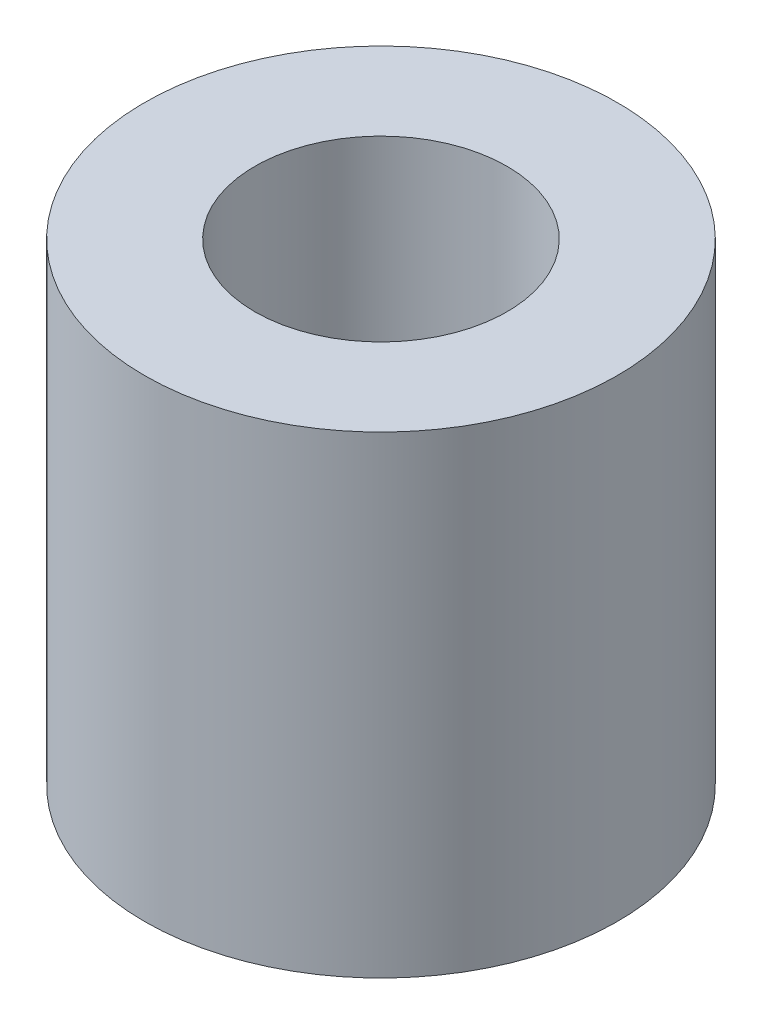
ISO-10303-21;
HEADER;
FILE_DESCRIPTION(('STEP AP214'),'2;1');
FILE_NAME('part.step','',(''),(''),'','','');
FILE_SCHEMA(('AUTOMOTIVE_DESIGN { 1 0 10303 214 1 1 1 1 }'));
ENDSEC;
DATA;
#1=APPLICATION_CONTEXT('core data for automotive mechanical design processes');
#2=APPLICATION_PROTOCOL_DEFINITION('international standard','automotive_design',2000,#1);
#3=PRODUCT_CONTEXT('',#1,'mechanical');
#4=PRODUCT('Part','Part','',(#3));
#5=PRODUCT_RELATED_PRODUCT_CATEGORY('part','',(#4));
#6=PRODUCT_DEFINITION_FORMATION('','',#4);
#7=PRODUCT_DEFINITION_CONTEXT('part definition',#1,'design');
#8=PRODUCT_DEFINITION('design','',#6,#7);
#9=PRODUCT_DEFINITION_SHAPE('','',#8);
#10=(LENGTH_UNIT() NAMED_UNIT(*) SI_UNIT(.MILLI.,.METRE.));
#11=(NAMED_UNIT(*) PLANE_ANGLE_UNIT() SI_UNIT($,.RADIAN.));
#12=(NAMED_UNIT(*) SI_UNIT($,.STERADIAN.) SOLID_ANGLE_UNIT());
#13=UNCERTAINTY_MEASURE_WITH_UNIT(LENGTH_MEASURE(1.E-05),#10,'distance_accuracy_value','');
#14=(GEOMETRIC_REPRESENTATION_CONTEXT(3) GLOBAL_UNCERTAINTY_ASSIGNED_CONTEXT((#13)) GLOBAL_UNIT_ASSIGNED_CONTEXT((#10,
#11,#12)) REPRESENTATION_CONTEXT('',''));
#15=CARTESIAN_POINT('',(0.,0.,0.));
#16=DIRECTION('',(0.,0.,1.));
#17=DIRECTION('',(1.,0.,0.));
#18=AXIS2_PLACEMENT_3D('',#15,#16,#17);
#19=CARTESIAN_POINT('',(0.,9.525,0.));
#20=DIRECTION('',(0.,1.,0.));
#21=DIRECTION('',(0.,0.,-1.));
#22=AXIS2_PLACEMENT_3D('',#19,#20,#21);
#23=PLANE('',#22);
#24=CARTESIAN_POINT('',(0.,9.525,0.));
#25=DIRECTION('',(0.,-1.,0.));
#26=DIRECTION('',(0.,0.,-1.));
#27=AXIS2_PLACEMENT_3D('',#24,#25,#26);
#28=CIRCLE('',#27,4.7625);
#29=CARTESIAN_POINT('',(0.,9.525,4.7625));
#30=VERTEX_POINT('',#29);
#31=EDGE_CURVE('E10',#30,#30,#28,.T.);
#32=ORIENTED_EDGE('',*,*,#31,.F.);
#33=EDGE_LOOP('',(#32));
#34=FACE_BOUND('',#33,.T.);
#35=CARTESIAN_POINT('',(0.,9.525,0.));
#36=DIRECTION('',(0.,-1.,0.));
#37=DIRECTION('',(0.,0.,-1.));
#38=AXIS2_PLACEMENT_3D('',#35,#36,#37);
#39=CIRCLE('',#38,2.54);
#40=CARTESIAN_POINT('',(0.,9.525,2.54));
#41=VERTEX_POINT('',#40);
#42=EDGE_CURVE('E58',#41,#41,#39,.T.);
#43=ORIENTED_EDGE('',*,*,#42,.T.);
#44=EDGE_LOOP('',(#43));
#45=FACE_BOUND('',#44,.T.);
#46=ADVANCED_FACE('F45',(#34,#45),#23,.T.);
#47=CARTESIAN_POINT('',(0.,0.,0.));
#48=DIRECTION('',(0.,1.,0.));
#49=DIRECTION('',(0.,0.,-1.));
#50=AXIS2_PLACEMENT_3D('',#47,#48,#49);
#51=PLANE('',#50);
#52=CARTESIAN_POINT('',(0.,0.,0.));
#53=DIRECTION('',(0.,-1.,0.));
#54=DIRECTION('',(0.,0.,-1.));
#55=AXIS2_PLACEMENT_3D('',#52,#53,#54);
#56=CIRCLE('',#55,4.7625);
#57=CARTESIAN_POINT('',(0.,0.,4.7625));
#58=VERTEX_POINT('',#57);
#59=EDGE_CURVE('E49',#58,#58,#56,.T.);
#60=ORIENTED_EDGE('',*,*,#59,.T.);
#61=EDGE_LOOP('',(#60));
#62=FACE_BOUND('',#61,.T.);
#63=CARTESIAN_POINT('',(0.,0.,0.));
#64=DIRECTION('',(0.,-1.,0.));
#65=DIRECTION('',(0.,0.,-1.));
#66=AXIS2_PLACEMENT_3D('',#63,#64,#65);
#67=CIRCLE('',#66,2.54);
#68=CARTESIAN_POINT('',(0.,0.,2.54));
#69=VERTEX_POINT('',#68);
#70=EDGE_CURVE('E60',#69,#69,#67,.T.);
#71=ORIENTED_EDGE('',*,*,#70,.F.);
#72=EDGE_LOOP('',(#71));
#73=FACE_BOUND('',#72,.T.);
#74=ADVANCED_FACE('F74',(#62,#73),#51,.F.);
#75=CARTESIAN_POINT('',(0.,9.525,0.));
#76=DIRECTION('',(0.,-1.,0.));
#77=DIRECTION('',(0.,0.,1.));
#78=AXIS2_PLACEMENT_3D('',#75,#76,#77);
#79=CYLINDRICAL_SURFACE('',#78,4.7625);
#80=CARTESIAN_POINT('',(0.,9.525,4.7625));
#81=CARTESIAN_POINT('',(0.,9.42578125,4.7625));
#82=CARTESIAN_POINT('',(0.,9.3265625,4.7625));
#83=CARTESIAN_POINT('',(0.,9.128125,4.7625));
#84=CARTESIAN_POINT('',(0.,9.02890625,4.7625));
#85=CARTESIAN_POINT('',(0.,8.83046875,4.7625));
#86=CARTESIAN_POINT('',(0.,8.73125,4.7625));
#87=CARTESIAN_POINT('',(0.,8.5328125,4.7625));
#88=CARTESIAN_POINT('',(0.,8.43359375,4.7625));
#89=CARTESIAN_POINT('',(0.,8.23515625,4.7625));
#90=CARTESIAN_POINT('',(0.,8.1359375,4.7625));
#91=CARTESIAN_POINT('',(0.,7.9375,4.7625));
#92=CARTESIAN_POINT('',(0.,7.83828125,4.7625));
#93=CARTESIAN_POINT('',(0.,7.63984375,4.7625));
#94=CARTESIAN_POINT('',(0.,7.540625,4.7625));
#95=CARTESIAN_POINT('',(0.,7.3421875,4.7625));
#96=CARTESIAN_POINT('',(0.,7.24296875,4.7625));
#97=CARTESIAN_POINT('',(0.,7.04453125,4.7625));
#98=CARTESIAN_POINT('',(0.,6.9453125,4.7625));
#99=CARTESIAN_POINT('',(0.,6.746875,4.7625));
#100=CARTESIAN_POINT('',(0.,6.64765625,4.7625));
#101=CARTESIAN_POINT('',(0.,6.44921875,4.7625));
#102=CARTESIAN_POINT('',(0.,6.35,4.7625));
#103=CARTESIAN_POINT('',(0.,6.1515625,4.7625));
#104=CARTESIAN_POINT('',(0.,6.05234375,4.7625));
#105=CARTESIAN_POINT('',(0.,5.85390625,4.7625));
#106=CARTESIAN_POINT('',(0.,5.7546875,4.7625));
#107=CARTESIAN_POINT('',(0.,5.55625,4.7625));
#108=CARTESIAN_POINT('',(0.,5.45703125,4.7625));
#109=CARTESIAN_POINT('',(0.,5.25859375,4.7625));
#110=CARTESIAN_POINT('',(0.,5.159375,4.7625));
#111=CARTESIAN_POINT('',(0.,4.9609375,4.7625));
#112=CARTESIAN_POINT('',(0.,4.86171875,4.7625));
#113=CARTESIAN_POINT('',(0.,4.66328125,4.7625));
#114=CARTESIAN_POINT('',(0.,4.5640625,4.7625));
#115=CARTESIAN_POINT('',(0.,4.365625,4.7625));
#116=CARTESIAN_POINT('',(0.,4.26640625,4.7625));
#117=CARTESIAN_POINT('',(0.,4.06796875,4.7625));
#118=CARTESIAN_POINT('',(0.,3.96875,4.7625));
#119=CARTESIAN_POINT('',(0.,3.7703125,4.7625));
#120=CARTESIAN_POINT('',(0.,3.67109375,4.7625));
#121=CARTESIAN_POINT('',(0.,3.47265625,4.7625));
#122=CARTESIAN_POINT('',(0.,3.3734375,4.7625));
#123=CARTESIAN_POINT('',(0.,3.175,4.7625));
#124=CARTESIAN_POINT('',(0.,3.07578125,4.7625));
#125=CARTESIAN_POINT('',(0.,2.87734375,4.7625));
#126=CARTESIAN_POINT('',(0.,2.778125,4.7625));
#127=CARTESIAN_POINT('',(0.,2.5796875,4.7625));
#128=CARTESIAN_POINT('',(0.,2.48046875,4.7625));
#129=CARTESIAN_POINT('',(0.,2.28203125,4.7625));
#130=CARTESIAN_POINT('',(0.,2.1828125,4.7625));
#131=CARTESIAN_POINT('',(0.,1.984375,4.7625));
#132=CARTESIAN_POINT('',(0.,1.88515625,4.7625));
#133=CARTESIAN_POINT('',(0.,1.68671875,4.7625));
#134=CARTESIAN_POINT('',(0.,1.5875,4.7625));
#135=CARTESIAN_POINT('',(0.,1.3890625,4.7625));
#136=CARTESIAN_POINT('',(0.,1.28984375,4.7625));
#137=CARTESIAN_POINT('',(0.,1.09140625,4.7625));
#138=CARTESIAN_POINT('',(0.,0.992187500000001,4.7625));
#139=CARTESIAN_POINT('',(0.,0.793750000000001,4.7625));
#140=CARTESIAN_POINT('',(0.,0.69453125,4.7625));
#141=CARTESIAN_POINT('',(0.,0.49609375,4.7625));
#142=CARTESIAN_POINT('',(0.,0.396875,4.7625));
#143=CARTESIAN_POINT('',(0.,0.1984375,4.7625));
#144=CARTESIAN_POINT('',(0.,0.0992187500000001,4.7625));
#145=CARTESIAN_POINT('',(0.,0.,4.7625));
#146=B_SPLINE_CURVE_WITH_KNOTS('',3,(#80,#81,#82,#83,#84,#85,#86,#87,#88,#89,#90,#91,#92,#93,
#94,#95,#96,#97,#98,#99,#100,#101,#102,#103,#104,#105,#106,#107,#108,#109,#110,#111,#112,#113,
#114,#115,#116,#117,#118,#119,#120,#121,#122,#123,#124,#125,#126,#127,#128,#129,#130,#131,#132,
#133,#134,#135,#136,#137,#138,#139,#140,#141,#142,#143,#144,#145),.UNSPECIFIED.,.F.,.F.,(4,2,2,
2,2,2,2,2,2,2,2,2,2,2,2,2,2,2,2,2,2,2,2,2,2,2,2,2,2,2,2,2,4),(0.,0.297656249999998,
0.595312499999999,0.892968749999999,1.190625,1.48828125,1.7859375,2.08359375,2.38125,2.67890625,
2.9765625,3.27421875,3.571875,3.86953125,4.1671875,4.46484375,4.7625,5.06015625,5.3578125,
5.65546875,5.953125,6.25078125,6.5484375,6.84609375,7.14375,7.44140625,7.7390625,8.03671875,
8.334375,8.63203125,8.9296875,9.22734375,9.525),.UNSPECIFIED.);
#147=EDGE_CURVE('BSEAM47',#30,#58,#146,.T.);
#148=ORIENTED_EDGE('',*,*,#31,.T.);
#149=ORIENTED_EDGE('',*,*,#59,.F.);
#150=ORIENTED_EDGE('',*,*,#147,.T.);
#151=ORIENTED_EDGE('',*,*,#147,.F.);
#152=EDGE_LOOP('',(#148,#150,#149,#151));
#153=FACE_BOUND('',#152,.T.);
#154=ADVANCED_FACE('F47',(#153),#79,.T.);
#155=CARTESIAN_POINT('',(0.,9.525,0.));
#156=DIRECTION('',(0.,-1.,0.));
#157=DIRECTION('',(0.,0.,1.));
#158=AXIS2_PLACEMENT_3D('',#155,#156,#157);
#159=CYLINDRICAL_SURFACE('',#158,2.54);
#160=CARTESIAN_POINT('',(0.,9.525,2.54));
#161=CARTESIAN_POINT('',(0.,9.42578125,2.54));
#162=CARTESIAN_POINT('',(0.,9.3265625,2.54));
#163=CARTESIAN_POINT('',(0.,9.128125,2.54));
#164=CARTESIAN_POINT('',(0.,9.02890625,2.54));
#165=CARTESIAN_POINT('',(0.,8.83046875,2.54));
#166=CARTESIAN_POINT('',(0.,8.73125,2.54));
#167=CARTESIAN_POINT('',(0.,8.5328125,2.54));
#168=CARTESIAN_POINT('',(0.,8.43359375,2.54));
#169=CARTESIAN_POINT('',(0.,8.23515625,2.54));
#170=CARTESIAN_POINT('',(0.,8.1359375,2.54));
#171=CARTESIAN_POINT('',(0.,7.9375,2.54));
#172=CARTESIAN_POINT('',(0.,7.83828125,2.54));
#173=CARTESIAN_POINT('',(0.,7.63984375,2.54));
#174=CARTESIAN_POINT('',(0.,7.540625,2.54));
#175=CARTESIAN_POINT('',(0.,7.3421875,2.54));
#176=CARTESIAN_POINT('',(0.,7.24296875,2.54));
#177=CARTESIAN_POINT('',(0.,7.04453125,2.54));
#178=CARTESIAN_POINT('',(0.,6.9453125,2.54));
#179=CARTESIAN_POINT('',(0.,6.746875,2.54));
#180=CARTESIAN_POINT('',(0.,6.64765625,2.54));
#181=CARTESIAN_POINT('',(0.,6.44921875,2.54));
#182=CARTESIAN_POINT('',(0.,6.35,2.54));
#183=CARTESIAN_POINT('',(0.,6.1515625,2.54));
#184=CARTESIAN_POINT('',(0.,6.05234375,2.54));
#185=CARTESIAN_POINT('',(0.,5.85390625,2.54));
#186=CARTESIAN_POINT('',(0.,5.7546875,2.54));
#187=CARTESIAN_POINT('',(0.,5.55625,2.54));
#188=CARTESIAN_POINT('',(0.,5.45703125,2.54));
#189=CARTESIAN_POINT('',(0.,5.25859375,2.54));
#190=CARTESIAN_POINT('',(0.,5.159375,2.54));
#191=CARTESIAN_POINT('',(0.,4.9609375,2.54));
#192=CARTESIAN_POINT('',(0.,4.86171875,2.54));
#193=CARTESIAN_POINT('',(0.,4.66328125,2.54));
#194=CARTESIAN_POINT('',(0.,4.5640625,2.54));
#195=CARTESIAN_POINT('',(0.,4.365625,2.54));
#196=CARTESIAN_POINT('',(0.,4.26640625,2.54));
#197=CARTESIAN_POINT('',(0.,4.06796875,2.54));
#198=CARTESIAN_POINT('',(0.,3.96875,2.54));
#199=CARTESIAN_POINT('',(0.,3.7703125,2.54));
#200=CARTESIAN_POINT('',(0.,3.67109375,2.54));
#201=CARTESIAN_POINT('',(0.,3.47265625,2.54));
#202=CARTESIAN_POINT('',(0.,3.3734375,2.54));
#203=CARTESIAN_POINT('',(0.,3.175,2.54));
#204=CARTESIAN_POINT('',(0.,3.07578125,2.54));
#205=CARTESIAN_POINT('',(0.,2.87734375,2.54));
#206=CARTESIAN_POINT('',(0.,2.778125,2.54));
#207=CARTESIAN_POINT('',(0.,2.5796875,2.54));
#208=CARTESIAN_POINT('',(0.,2.48046875,2.54));
#209=CARTESIAN_POINT('',(0.,2.28203125,2.54));
#210=CARTESIAN_POINT('',(0.,2.1828125,2.54));
#211=CARTESIAN_POINT('',(0.,1.984375,2.54));
#212=CARTESIAN_POINT('',(0.,1.88515625,2.54));
#213=CARTESIAN_POINT('',(0.,1.68671875,2.54));
#214=CARTESIAN_POINT('',(0.,1.5875,2.54));
#215=CARTESIAN_POINT('',(0.,1.3890625,2.54));
#216=CARTESIAN_POINT('',(0.,1.28984375,2.54));
#217=CARTESIAN_POINT('',(0.,1.09140625,2.54));
#218=CARTESIAN_POINT('',(0.,0.992187500000001,2.54));
#219=CARTESIAN_POINT('',(0.,0.793750000000001,2.54));
#220=CARTESIAN_POINT('',(0.,0.69453125,2.54));
#221=CARTESIAN_POINT('',(0.,0.49609375,2.54));
#222=CARTESIAN_POINT('',(0.,0.396875,2.54));
#223=CARTESIAN_POINT('',(0.,0.1984375,2.54));
#224=CARTESIAN_POINT('',(0.,0.0992187500000001,2.54));
#225=CARTESIAN_POINT('',(0.,0.,2.54));
#226=B_SPLINE_CURVE_WITH_KNOTS('',3,(#160,#161,#162,#163,#164,#165,#166,#167,#168,#169,#170,
#171,#172,#173,#174,#175,#176,#177,#178,#179,#180,#181,#182,#183,#184,#185,#186,#187,#188,#189,
#190,#191,#192,#193,#194,#195,#196,#197,#198,#199,#200,#201,#202,#203,#204,#205,#206,#207,#208,
#209,#210,#211,#212,#213,#214,#215,#216,#217,#218,#219,#220,#221,#222,#223,#224,#225),
.UNSPECIFIED.,.F.,.F.,(4,2,2,2,2,2,2,2,2,2,2,2,2,2,2,2,2,2,2,2,2,2,2,2,2,2,2,2,2,2,2,2,4),(0.,
0.29765625,0.5953125,0.892968750000001,1.190625,1.48828125,1.7859375,2.08359375,2.38125,
2.67890625,2.9765625,3.27421875,3.571875,3.86953125,4.1671875,4.46484375,4.7625,5.06015625,
5.3578125,5.65546875,5.953125,6.25078125,6.5484375,6.84609375,7.14375,7.44140625,7.7390625,
8.03671875,8.334375,8.63203125,8.9296875,9.22734375,9.525),.UNSPECIFIED.);
#227=EDGE_CURVE('BSEAM68',#41,#69,#226,.T.);
#228=ORIENTED_EDGE('',*,*,#42,.F.);
#229=ORIENTED_EDGE('',*,*,#70,.T.);
#230=ORIENTED_EDGE('',*,*,#227,.T.);
#231=ORIENTED_EDGE('',*,*,#227,.F.);
#232=EDGE_LOOP('',(#228,#230,#229,#231));
#233=FACE_BOUND('',#232,.T.);
#234=ADVANCED_FACE('F68',(#233),#159,.F.);
#235=CLOSED_SHELL('',(#46,#74,#154,#234));
#236=MANIFOLD_SOLID_BREP('B2',#235);
#237=ADVANCED_BREP_SHAPE_REPRESENTATION('',(#18,#236),#14);
#238=SHAPE_DEFINITION_REPRESENTATION(#9,#237);
ENDSEC;
END-ISO-10303-21;
